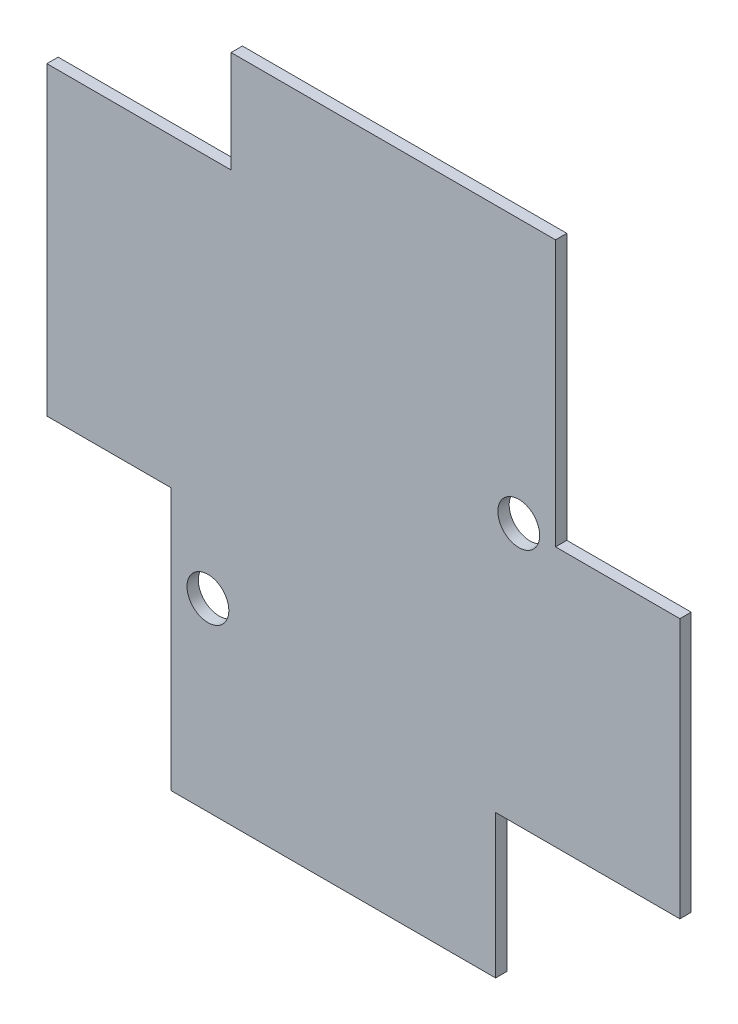
ISO-10303-21;
HEADER;
FILE_DESCRIPTION(('STEP AP214'),'2;1');
FILE_NAME('part.step','',(''),(''),'','','');
FILE_SCHEMA(('AUTOMOTIVE_DESIGN { 1 0 10303 214 1 1 1 1 }'));
ENDSEC;
DATA;
#1=APPLICATION_CONTEXT('core data for automotive mechanical design processes');
#2=APPLICATION_PROTOCOL_DEFINITION('international standard','automotive_design',2000,#1);
#3=PRODUCT_CONTEXT('',#1,'mechanical');
#4=PRODUCT('Part','Part','',(#3));
#5=PRODUCT_RELATED_PRODUCT_CATEGORY('part','',(#4));
#6=PRODUCT_DEFINITION_FORMATION('','',#4);
#7=PRODUCT_DEFINITION_CONTEXT('part definition',#1,'design');
#8=PRODUCT_DEFINITION('design','',#6,#7);
#9=PRODUCT_DEFINITION_SHAPE('','',#8);
#10=(LENGTH_UNIT() NAMED_UNIT(*) SI_UNIT(.MILLI.,.METRE.));
#11=(NAMED_UNIT(*) PLANE_ANGLE_UNIT() SI_UNIT($,.RADIAN.));
#12=(NAMED_UNIT(*) SI_UNIT($,.STERADIAN.) SOLID_ANGLE_UNIT());
#13=UNCERTAINTY_MEASURE_WITH_UNIT(LENGTH_MEASURE(1.E-05),#10,'distance_accuracy_value','');
#14=(GEOMETRIC_REPRESENTATION_CONTEXT(3) GLOBAL_UNCERTAINTY_ASSIGNED_CONTEXT((#13)) GLOBAL_UNIT_ASSIGNED_CONTEXT((#10,
#11,#12)) REPRESENTATION_CONTEXT('',''));
#15=CARTESIAN_POINT('',(0.,0.,0.));
#16=DIRECTION('',(0.,0.,1.));
#17=DIRECTION('',(1.,0.,0.));
#18=AXIS2_PLACEMENT_3D('',#15,#16,#17);
#19=CARTESIAN_POINT('',(0.,0.,-43.05));
#20=DIRECTION('',(0.,0.,1.));
#21=DIRECTION('',(1.,0.,0.));
#22=AXIS2_PLACEMENT_3D('',#19,#20,#21);
#23=PLANE('',#22);
#24=CARTESIAN_POINT('',(13.75,5.75,-43.05));
#25=DIRECTION('',(0.,0.,1.));
#26=DIRECTION('',(1.,0.,0.));
#27=AXIS2_PLACEMENT_3D('',#24,#25,#26);
#28=CIRCLE('',#27,1.85);
#29=CARTESIAN_POINT('',(15.6,5.75,-43.05));
#30=VERTEX_POINT('',#29);
#31=EDGE_CURVE('E155',#30,#30,#28,.F.);
#32=ORIENTED_EDGE('',*,*,#31,.T.);
#33=EDGE_LOOP('',(#32));
#34=FACE_BOUND('',#33,.T.);
#35=CARTESIAN_POINT('',(-13.75,-13.75,-43.05));
#36=DIRECTION('',(0.,0.,1.));
#37=DIRECTION('',(1.,0.,0.));
#38=AXIS2_PLACEMENT_3D('',#35,#36,#37);
#39=CIRCLE('',#38,1.85);
#40=CARTESIAN_POINT('',(-11.9,-13.75,-43.05));
#41=VERTEX_POINT('',#40);
#42=EDGE_CURVE('E20',#41,#41,#39,.F.);
#43=ORIENTED_EDGE('',*,*,#42,.T.);
#44=EDGE_LOOP('',(#43));
#45=FACE_BOUND('',#44,.T.);
#46=DIRECTION('',(1.,0.,0.));
#47=VECTOR('',#46,1.);
#48=CARTESIAN_POINT('',(28.,5.579559179887,-43.05));
#49=LINE('',#48,#47);
#50=CARTESIAN_POINT('',(17.,5.579559179887,-43.05));
#51=VERTEX_POINT('',#50);
#52=CARTESIAN_POINT('',(28.,5.579559179887,-43.05));
#53=VERTEX_POINT('',#52);
#54=EDGE_CURVE('E118',#51,#53,#49,.T.);
#55=ORIENTED_EDGE('',*,*,#54,.F.);
#56=DIRECTION('',(0.,1.,0.));
#57=VECTOR('',#56,1.);
#58=CARTESIAN_POINT('',(17.,-17.,-43.05));
#59=LINE('',#58,#57);
#60=CARTESIAN_POINT('',(17.,29.1,-43.05));
#61=VERTEX_POINT('',#60);
#62=EDGE_CURVE('E217',#61,#51,#59,.F.);
#63=ORIENTED_EDGE('',*,*,#62,.F.);
#64=DIRECTION('',(1.,0.,0.));
#65=VECTOR('',#64,1.);
#66=CARTESIAN_POINT('',(17.,29.1,-43.05));
#67=LINE('',#66,#65);
#68=CARTESIAN_POINT('',(-11.7,29.1,-43.05));
#69=VERTEX_POINT('',#68);
#70=EDGE_CURVE('E211',#69,#61,#67,.T.);
#71=ORIENTED_EDGE('',*,*,#70,.F.);
#72=DIRECTION('',(0.,1.,0.));
#73=VECTOR('',#72,1.);
#74=CARTESIAN_POINT('',(-11.7,21.1,-43.05));
#75=LINE('',#74,#73);
#76=CARTESIAN_POINT('',(-11.7,20.1,-43.05));
#77=VERTEX_POINT('',#76);
#78=EDGE_CURVE('E202',#69,#77,#75,.F.);
#79=ORIENTED_EDGE('',*,*,#78,.T.);
#80=DIRECTION('',(1.,0.,0.));
#81=VECTOR('',#80,1.);
#82=CARTESIAN_POINT('',(-19.45592500181,20.1,-43.05));
#83=LINE('',#82,#81);
#84=CARTESIAN_POINT('',(-28.,20.1,-43.05));
#85=VERTEX_POINT('',#84);
#86=EDGE_CURVE('E200',#77,#85,#83,.F.);
#87=ORIENTED_EDGE('',*,*,#86,.T.);
#88=DIRECTION('',(0.,1.,0.));
#89=VECTOR('',#88,1.);
#90=CARTESIAN_POINT('',(-28.,20.1,-43.05));
#91=LINE('',#90,#89);
#92=CARTESIAN_POINT('',(-28.,-6.9,-43.05));
#93=VERTEX_POINT('',#92);
#94=EDGE_CURVE('E191',#93,#85,#91,.T.);
#95=ORIENTED_EDGE('',*,*,#94,.F.);
#96=DIRECTION('',(1.,0.,0.));
#97=VECTOR('',#96,1.);
#98=CARTESIAN_POINT('',(-28.,-6.9,-43.05));
#99=LINE('',#98,#97);
#100=CARTESIAN_POINT('',(-17.,-6.9,-43.05));
#101=VERTEX_POINT('',#100);
#102=EDGE_CURVE('E188',#101,#93,#99,.F.);
#103=ORIENTED_EDGE('',*,*,#102,.F.);
#104=DIRECTION('',(0.,1.,0.));
#105=VECTOR('',#104,1.);
#106=CARTESIAN_POINT('',(-17.,17.,-43.05));
#107=LINE('',#106,#105);
#108=CARTESIAN_POINT('',(-17.,-30.1,-43.05));
#109=VERTEX_POINT('',#108);
#110=EDGE_CURVE('E182',#109,#101,#107,.T.);
#111=ORIENTED_EDGE('',*,*,#110,.F.);
#112=DIRECTION('',(1.,0.,0.));
#113=VECTOR('',#112,1.);
#114=CARTESIAN_POINT('',(-17.,-30.1,-43.05));
#115=LINE('',#114,#113);
#116=CARTESIAN_POINT('',(11.7,-30.1,-43.05));
#117=VERTEX_POINT('',#116);
#118=EDGE_CURVE('E176',#117,#109,#115,.F.);
#119=ORIENTED_EDGE('',*,*,#118,.F.);
#120=DIRECTION('',(0.,1.,0.));
#121=VECTOR('',#120,1.);
#122=CARTESIAN_POINT('',(11.7,-17.42044082011,-43.05));
#123=LINE('',#122,#121);
#124=CARTESIAN_POINT('',(11.7,-17.42044082011,-43.05));
#125=VERTEX_POINT('',#124);
#126=EDGE_CURVE('E128',#117,#125,#123,.T.);
#127=ORIENTED_EDGE('',*,*,#126,.T.);
#128=DIRECTION('',(1.,0.,0.));
#129=VECTOR('',#128,1.);
#130=CARTESIAN_POINT('',(19.97261027655,-17.42044082011,-43.05));
#131=LINE('',#130,#129);
#132=CARTESIAN_POINT('',(28.,-17.42044082011,-43.05));
#133=VERTEX_POINT('',#132);
#134=EDGE_CURVE('E124',#125,#133,#131,.T.);
#135=ORIENTED_EDGE('',*,*,#134,.T.);
#136=DIRECTION('',(0.,1.,0.));
#137=VECTOR('',#136,1.);
#138=CARTESIAN_POINT('',(28.,-17.42044082011,-43.05));
#139=LINE('',#138,#137);
#140=EDGE_CURVE('E126',#53,#133,#139,.F.);
#141=ORIENTED_EDGE('',*,*,#140,.F.);
#142=EDGE_LOOP('',(#55,#63,#71,#79,#87,#95,#103,#111,#119,#127,#135,#141));
#143=FACE_BOUND('',#142,.T.);
#144=ADVANCED_FACE('F17',(#34,#45,#143),#23,.T.);
#145=CARTESIAN_POINT('',(19.97261027655,-17.42044082011,-37.8));
#146=DIRECTION('',(0.,1.,0.));
#147=DIRECTION('',(0.,0.,1.));
#148=AXIS2_PLACEMENT_3D('',#145,#146,#147);
#149=PLANE('',#148);
#150=DIRECTION('',(1.,0.,0.));
#151=VECTOR('',#150,1.);
#152=CARTESIAN_POINT('',(0.,-17.42044082011,-44.05));
#153=LINE('',#152,#151);
#154=CARTESIAN_POINT('',(11.7,-17.42044082011,-44.05));
#155=VERTEX_POINT('',#154);
#156=CARTESIAN_POINT('',(28.,-17.42044082011,-44.05));
#157=VERTEX_POINT('',#156);
#158=EDGE_CURVE('E145',#155,#157,#153,.T.);
#159=ORIENTED_EDGE('',*,*,#158,.T.);
#160=DIRECTION('',(0.,0.,-1.));
#161=VECTOR('',#160,1.);
#162=CARTESIAN_POINT('',(28.,-17.42044082011,-43.05));
#163=LINE('',#162,#161);
#164=EDGE_CURVE('E134',#133,#157,#163,.T.);
#165=ORIENTED_EDGE('',*,*,#164,.F.);
#166=ORIENTED_EDGE('',*,*,#134,.F.);
#167=DIRECTION('',(0.,0.,1.));
#168=VECTOR('',#167,1.);
#169=CARTESIAN_POINT('',(11.7,-17.42044082011,-37.8));
#170=LINE('',#169,#168);
#171=EDGE_CURVE('E165',#125,#155,#170,.F.);
#172=ORIENTED_EDGE('',*,*,#171,.T.);
#173=EDGE_LOOP('',(#159,#165,#166,#172));
#174=FACE_BOUND('',#173,.T.);
#175=ADVANCED_FACE('F144',(#174),#149,.F.);
#176=CARTESIAN_POINT('',(28.,-17.42044082011,-43.05));
#177=DIRECTION('',(1.,0.,0.));
#178=DIRECTION('',(0.,0.,-1.));
#179=AXIS2_PLACEMENT_3D('',#176,#177,#178);
#180=PLANE('',#179);
#181=DIRECTION('',(0.,0.,1.));
#182=VECTOR('',#181,1.);
#183=CARTESIAN_POINT('',(28.,5.579559179887,-43.05));
#184=LINE('',#183,#182);
#185=CARTESIAN_POINT('',(28.,5.579559179887,-44.05));
#186=VERTEX_POINT('',#185);
#187=EDGE_CURVE('E140',#53,#186,#184,.F.);
#188=ORIENTED_EDGE('',*,*,#187,.F.);
#189=ORIENTED_EDGE('',*,*,#140,.T.);
#190=ORIENTED_EDGE('',*,*,#164,.T.);
#191=DIRECTION('',(0.,1.,0.));
#192=VECTOR('',#191,1.);
#193=CARTESIAN_POINT('',(28.,0.,-44.05));
#194=LINE('',#193,#192);
#195=EDGE_CURVE('E161',#157,#186,#194,.T.);
#196=ORIENTED_EDGE('',*,*,#195,.T.);
#197=EDGE_LOOP('',(#188,#189,#190,#196));
#198=FACE_BOUND('',#197,.T.);
#199=ADVANCED_FACE('F137',(#198),#180,.T.);
#200=CARTESIAN_POINT('',(28.,5.579559179887,-43.05));
#201=DIRECTION('',(0.,1.,0.));
#202=DIRECTION('',(0.,0.,1.));
#203=AXIS2_PLACEMENT_3D('',#200,#201,#202);
#204=PLANE('',#203);
#205=DIRECTION('',(1.,0.,0.));
#206=VECTOR('',#205,1.);
#207=CARTESIAN_POINT('',(0.,5.579559179887,-44.05));
#208=LINE('',#207,#206);
#209=CARTESIAN_POINT('',(17.,5.579559179887,-44.05));
#210=VERTEX_POINT('',#209);
#211=EDGE_CURVE('E228',#186,#210,#208,.F.);
#212=ORIENTED_EDGE('',*,*,#211,.T.);
#213=DIRECTION('',(0.,0.,-1.));
#214=VECTOR('',#213,1.);
#215=CARTESIAN_POINT('',(17.,5.579559179887,-44.05));
#216=LINE('',#215,#214);
#217=EDGE_CURVE('E214',#51,#210,#216,.T.);
#218=ORIENTED_EDGE('',*,*,#217,.F.);
#219=ORIENTED_EDGE('',*,*,#54,.T.);
#220=ORIENTED_EDGE('',*,*,#187,.T.);
#221=EDGE_LOOP('',(#212,#218,#219,#220));
#222=FACE_BOUND('',#221,.T.);
#223=ADVANCED_FACE('F296',(#222),#204,.T.);
#224=CARTESIAN_POINT('',(17.,-17.,-44.05));
#225=DIRECTION('',(1.,0.,0.));
#226=DIRECTION('',(0.,0.,-1.));
#227=AXIS2_PLACEMENT_3D('',#224,#225,#226);
#228=PLANE('',#227);
#229=ORIENTED_EDGE('',*,*,#62,.T.);
#230=ORIENTED_EDGE('',*,*,#217,.T.);
#231=DIRECTION('',(0.,1.,0.));
#232=VECTOR('',#231,1.);
#233=CARTESIAN_POINT('',(17.,0.,-44.05));
#234=LINE('',#233,#232);
#235=CARTESIAN_POINT('',(17.,29.1,-44.05));
#236=VERTEX_POINT('',#235);
#237=EDGE_CURVE('E225',#210,#236,#234,.T.);
#238=ORIENTED_EDGE('',*,*,#237,.T.);
#239=DIRECTION('',(0.,0.,1.));
#240=VECTOR('',#239,1.);
#241=CARTESIAN_POINT('',(17.,29.1,-43.05));
#242=LINE('',#241,#240);
#243=EDGE_CURVE('E208',#61,#236,#242,.F.);
#244=ORIENTED_EDGE('',*,*,#243,.F.);
#245=EDGE_LOOP('',(#229,#230,#238,#244));
#246=FACE_BOUND('',#245,.T.);
#247=ADVANCED_FACE('F295',(#246),#228,.T.);
#248=CARTESIAN_POINT('',(17.,29.1,-43.05));
#249=DIRECTION('',(0.,1.,0.));
#250=DIRECTION('',(0.,0.,1.));
#251=AXIS2_PLACEMENT_3D('',#248,#249,#250);
#252=PLANE('',#251);
#253=DIRECTION('',(1.,0.,0.));
#254=VECTOR('',#253,1.);
#255=CARTESIAN_POINT('',(0.,29.1,-44.05));
#256=LINE('',#255,#254);
#257=CARTESIAN_POINT('',(-11.7,29.1,-44.05));
#258=VERTEX_POINT('',#257);
#259=EDGE_CURVE('E227',#236,#258,#256,.F.);
#260=ORIENTED_EDGE('',*,*,#259,.T.);
#261=DIRECTION('',(0.,0.,-1.));
#262=VECTOR('',#261,1.);
#263=CARTESIAN_POINT('',(-11.7,29.1,-43.05));
#264=LINE('',#263,#262);
#265=EDGE_CURVE('E205',#258,#69,#264,.F.);
#266=ORIENTED_EDGE('',*,*,#265,.T.);
#267=ORIENTED_EDGE('',*,*,#70,.T.);
#268=ORIENTED_EDGE('',*,*,#243,.T.);
#269=EDGE_LOOP('',(#260,#266,#267,#268));
#270=FACE_BOUND('',#269,.T.);
#271=ADVANCED_FACE('F291',(#270),#252,.T.);
#272=CARTESIAN_POINT('',(-11.7,21.1,-43.05));
#273=DIRECTION('',(1.,0.,0.));
#274=DIRECTION('',(0.,0.,-1.));
#275=AXIS2_PLACEMENT_3D('',#272,#273,#274);
#276=PLANE('',#275);
#277=ORIENTED_EDGE('',*,*,#78,.F.);
#278=ORIENTED_EDGE('',*,*,#265,.F.);
#279=DIRECTION('',(0.,1.,0.));
#280=VECTOR('',#279,1.);
#281=CARTESIAN_POINT('',(-11.7,0.,-44.05));
#282=LINE('',#281,#280);
#283=CARTESIAN_POINT('',(-11.7,20.1,-44.05));
#284=VERTEX_POINT('',#283);
#285=EDGE_CURVE('E237',#258,#284,#282,.F.);
#286=ORIENTED_EDGE('',*,*,#285,.T.);
#287=DIRECTION('',(0.,0.,-1.));
#288=VECTOR('',#287,1.);
#289=CARTESIAN_POINT('',(-11.7,20.1,-43.05));
#290=LINE('',#289,#288);
#291=EDGE_CURVE('E197',#284,#77,#290,.F.);
#292=ORIENTED_EDGE('',*,*,#291,.T.);
#293=EDGE_LOOP('',(#277,#278,#286,#292));
#294=FACE_BOUND('',#293,.T.);
#295=ADVANCED_FACE('F287',(#294),#276,.F.);
#296=CARTESIAN_POINT('',(-19.45592500181,20.1,-43.05));
#297=DIRECTION('',(0.,-1.,0.));
#298=DIRECTION('',(0.,0.,-1.));
#299=AXIS2_PLACEMENT_3D('',#296,#297,#298);
#300=PLANE('',#299);
#301=DIRECTION('',(1.,0.,0.));
#302=VECTOR('',#301,1.);
#303=CARTESIAN_POINT('',(0.,20.1,-44.05));
#304=LINE('',#303,#302);
#305=CARTESIAN_POINT('',(-28.,20.1,-44.05));
#306=VERTEX_POINT('',#305);
#307=EDGE_CURVE('E240',#284,#306,#304,.F.);
#308=ORIENTED_EDGE('',*,*,#307,.T.);
#309=DIRECTION('',(0.,0.,1.));
#310=VECTOR('',#309,1.);
#311=CARTESIAN_POINT('',(-28.,20.1,-43.05));
#312=LINE('',#311,#310);
#313=EDGE_CURVE('E195',#85,#306,#312,.F.);
#314=ORIENTED_EDGE('',*,*,#313,.F.);
#315=ORIENTED_EDGE('',*,*,#86,.F.);
#316=ORIENTED_EDGE('',*,*,#291,.F.);
#317=EDGE_LOOP('',(#308,#314,#315,#316));
#318=FACE_BOUND('',#317,.T.);
#319=ADVANCED_FACE('F284',(#318),#300,.F.);
#320=CARTESIAN_POINT('',(-28.,20.1,-43.05));
#321=DIRECTION('',(-1.,0.,0.));
#322=DIRECTION('',(0.,0.,1.));
#323=AXIS2_PLACEMENT_3D('',#320,#321,#322);
#324=PLANE('',#323);
#325=DIRECTION('',(0.,0.,-1.));
#326=VECTOR('',#325,1.);
#327=CARTESIAN_POINT('',(-28.,-6.9,-43.05));
#328=LINE('',#327,#326);
#329=CARTESIAN_POINT('',(-28.,-6.9,-44.05));
#330=VERTEX_POINT('',#329);
#331=EDGE_CURVE('E185',#93,#330,#328,.T.);
#332=ORIENTED_EDGE('',*,*,#331,.F.);
#333=ORIENTED_EDGE('',*,*,#94,.T.);
#334=ORIENTED_EDGE('',*,*,#313,.T.);
#335=DIRECTION('',(0.,1.,0.));
#336=VECTOR('',#335,1.);
#337=CARTESIAN_POINT('',(-28.,0.,-44.05));
#338=LINE('',#337,#336);
#339=EDGE_CURVE('E243',#306,#330,#338,.F.);
#340=ORIENTED_EDGE('',*,*,#339,.T.);
#341=EDGE_LOOP('',(#332,#333,#334,#340));
#342=FACE_BOUND('',#341,.T.);
#343=ADVANCED_FACE('F279',(#342),#324,.T.);
#344=CARTESIAN_POINT('',(-28.,-6.9,-43.05));
#345=DIRECTION('',(0.,-1.,0.));
#346=DIRECTION('',(0.,0.,-1.));
#347=AXIS2_PLACEMENT_3D('',#344,#345,#346);
#348=PLANE('',#347);
#349=DIRECTION('',(1.,0.,0.));
#350=VECTOR('',#349,1.);
#351=CARTESIAN_POINT('',(0.,-6.9,-44.05));
#352=LINE('',#351,#350);
#353=CARTESIAN_POINT('',(-17.,-6.9,-44.05));
#354=VERTEX_POINT('',#353);
#355=EDGE_CURVE('E247',#330,#354,#352,.T.);
#356=ORIENTED_EDGE('',*,*,#355,.T.);
#357=DIRECTION('',(0.,0.,1.));
#358=VECTOR('',#357,1.);
#359=CARTESIAN_POINT('',(-17.,-6.9,-44.05));
#360=LINE('',#359,#358);
#361=EDGE_CURVE('E179',#101,#354,#360,.F.);
#362=ORIENTED_EDGE('',*,*,#361,.F.);
#363=ORIENTED_EDGE('',*,*,#102,.T.);
#364=ORIENTED_EDGE('',*,*,#331,.T.);
#365=EDGE_LOOP('',(#356,#362,#363,#364));
#366=FACE_BOUND('',#365,.T.);
#367=ADVANCED_FACE('F275',(#366),#348,.T.);
#368=CARTESIAN_POINT('',(-17.,17.,-44.05));
#369=DIRECTION('',(-1.,0.,0.));
#370=DIRECTION('',(0.,0.,1.));
#371=AXIS2_PLACEMENT_3D('',#368,#369,#370);
#372=PLANE('',#371);
#373=ORIENTED_EDGE('',*,*,#110,.T.);
#374=ORIENTED_EDGE('',*,*,#361,.T.);
#375=DIRECTION('',(0.,1.,0.));
#376=VECTOR('',#375,1.);
#377=CARTESIAN_POINT('',(-17.,0.,-44.05));
#378=LINE('',#377,#376);
#379=CARTESIAN_POINT('',(-17.,-30.1,-44.05));
#380=VERTEX_POINT('',#379);
#381=EDGE_CURVE('E251',#354,#380,#378,.F.);
#382=ORIENTED_EDGE('',*,*,#381,.T.);
#383=DIRECTION('',(0.,0.,-1.));
#384=VECTOR('',#383,1.);
#385=CARTESIAN_POINT('',(-17.,-30.1,-43.05));
#386=LINE('',#385,#384);
#387=EDGE_CURVE('E173',#109,#380,#386,.T.);
#388=ORIENTED_EDGE('',*,*,#387,.F.);
#389=EDGE_LOOP('',(#373,#374,#382,#388));
#390=FACE_BOUND('',#389,.T.);
#391=ADVANCED_FACE('F269',(#390),#372,.T.);
#392=CARTESIAN_POINT('',(-17.,-30.1,-43.05));
#393=DIRECTION('',(0.,-1.,0.));
#394=DIRECTION('',(0.,0.,-1.));
#395=AXIS2_PLACEMENT_3D('',#392,#393,#394);
#396=PLANE('',#395);
#397=DIRECTION('',(1.,0.,0.));
#398=VECTOR('',#397,1.);
#399=CARTESIAN_POINT('',(0.,-30.1,-44.05));
#400=LINE('',#399,#398);
#401=CARTESIAN_POINT('',(11.7,-30.1,-44.05));
#402=VERTEX_POINT('',#401);
#403=EDGE_CURVE('E255',#380,#402,#400,.T.);
#404=ORIENTED_EDGE('',*,*,#403,.T.);
#405=DIRECTION('',(0.,0.,1.));
#406=VECTOR('',#405,1.);
#407=CARTESIAN_POINT('',(11.7,-30.1,-37.8));
#408=LINE('',#407,#406);
#409=EDGE_CURVE('E36',#402,#117,#408,.T.);
#410=ORIENTED_EDGE('',*,*,#409,.T.);
#411=ORIENTED_EDGE('',*,*,#118,.T.);
#412=ORIENTED_EDGE('',*,*,#387,.T.);
#413=EDGE_LOOP('',(#404,#410,#411,#412));
#414=FACE_BOUND('',#413,.T.);
#415=ADVANCED_FACE('F265',(#414),#396,.T.);
#416=CARTESIAN_POINT('',(11.7,-17.42044082011,-37.8));
#417=DIRECTION('',(-1.,0.,0.));
#418=DIRECTION('',(0.,0.,1.));
#419=AXIS2_PLACEMENT_3D('',#416,#417,#418);
#420=PLANE('',#419);
#421=ORIENTED_EDGE('',*,*,#126,.F.);
#422=ORIENTED_EDGE('',*,*,#409,.F.);
#423=DIRECTION('',(0.,1.,0.));
#424=VECTOR('',#423,1.);
#425=CARTESIAN_POINT('',(11.7,0.,-44.05));
#426=LINE('',#425,#424);
#427=EDGE_CURVE('E154',#402,#155,#426,.T.);
#428=ORIENTED_EDGE('',*,*,#427,.T.);
#429=ORIENTED_EDGE('',*,*,#171,.F.);
#430=EDGE_LOOP('',(#421,#422,#428,#429));
#431=FACE_BOUND('',#430,.T.);
#432=ADVANCED_FACE('F259',(#431),#420,.F.);
#433=CARTESIAN_POINT('',(-13.75,-13.75,-43.05));
#434=DIRECTION('',(0.,0.,1.));
#435=DIRECTION('',(1.,0.,0.));
#436=AXIS2_PLACEMENT_3D('',#433,#434,#435);
#437=CYLINDRICAL_SURFACE('',#436,1.85);
#438=ORIENTED_EDGE('',*,*,#42,.F.);
#439=EDGE_LOOP('',(#438));
#440=FACE_BOUND('',#439,.T.);
#441=CARTESIAN_POINT('',(-13.75,-13.75,-44.05));
#442=DIRECTION('',(0.,0.,1.));
#443=DIRECTION('',(1.,0.,0.));
#444=AXIS2_PLACEMENT_3D('',#441,#442,#443);
#445=CIRCLE('',#444,1.85);
#446=CARTESIAN_POINT('',(-11.9,-13.75,-44.05));
#447=VERTEX_POINT('',#446);
#448=EDGE_CURVE('E27',#447,#447,#445,.F.);
#449=ORIENTED_EDGE('',*,*,#448,.T.);
#450=EDGE_LOOP('',(#449));
#451=FACE_BOUND('',#450,.T.);
#452=ADVANCED_FACE('F313',(#440,#451),#437,.F.);
#453=CARTESIAN_POINT('',(13.75,5.75,-43.05));
#454=DIRECTION('',(0.,0.,1.));
#455=DIRECTION('',(1.,0.,0.));
#456=AXIS2_PLACEMENT_3D('',#453,#454,#455);
#457=CYLINDRICAL_SURFACE('',#456,1.85);
#458=ORIENTED_EDGE('',*,*,#31,.F.);
#459=EDGE_LOOP('',(#458));
#460=FACE_BOUND('',#459,.T.);
#461=CARTESIAN_POINT('',(13.75,5.75,-44.05));
#462=DIRECTION('',(0.,0.,1.));
#463=DIRECTION('',(1.,0.,0.));
#464=AXIS2_PLACEMENT_3D('',#461,#462,#463);
#465=CIRCLE('',#464,1.85);
#466=CARTESIAN_POINT('',(15.6,5.75,-44.05));
#467=VERTEX_POINT('',#466);
#468=EDGE_CURVE('E11',#467,#467,#465,.F.);
#469=ORIENTED_EDGE('',*,*,#468,.T.);
#470=EDGE_LOOP('',(#469));
#471=FACE_BOUND('',#470,.T.);
#472=ADVANCED_FACE('F307',(#460,#471),#457,.F.);
#473=CARTESIAN_POINT('',(0.,0.,-44.05));
#474=DIRECTION('',(0.,0.,1.));
#475=DIRECTION('',(1.,0.,0.));
#476=AXIS2_PLACEMENT_3D('',#473,#474,#475);
#477=PLANE('',#476);
#478=ORIENTED_EDGE('',*,*,#468,.F.);
#479=EDGE_LOOP('',(#478));
#480=FACE_BOUND('',#479,.T.);
#481=ORIENTED_EDGE('',*,*,#448,.F.);
#482=EDGE_LOOP('',(#481));
#483=FACE_BOUND('',#482,.T.);
#484=ORIENTED_EDGE('',*,*,#403,.F.);
#485=ORIENTED_EDGE('',*,*,#381,.F.);
#486=ORIENTED_EDGE('',*,*,#355,.F.);
#487=ORIENTED_EDGE('',*,*,#339,.F.);
#488=ORIENTED_EDGE('',*,*,#307,.F.);
#489=ORIENTED_EDGE('',*,*,#285,.F.);
#490=ORIENTED_EDGE('',*,*,#259,.F.);
#491=ORIENTED_EDGE('',*,*,#237,.F.);
#492=ORIENTED_EDGE('',*,*,#211,.F.);
#493=ORIENTED_EDGE('',*,*,#195,.F.);
#494=ORIENTED_EDGE('',*,*,#158,.F.);
#495=ORIENTED_EDGE('',*,*,#427,.F.);
#496=EDGE_LOOP('',(#484,#485,#486,#487,#488,#489,#490,#491,#492,#493,#494,#495));
#497=FACE_BOUND('',#496,.T.);
#498=ADVANCED_FACE('F262',(#480,#483,#497),#477,.F.);
#499=CLOSED_SHELL('',(#144,#175,#199,#223,#247,#271,#295,#319,#343,#367,#391,#415,#432,#452,
#472,#498));
#500=MANIFOLD_SOLID_BREP('B1',#499);
#501=ADVANCED_BREP_SHAPE_REPRESENTATION('',(#18,#500),#14);
#502=SHAPE_DEFINITION_REPRESENTATION(#9,#501);
ENDSEC;
END-ISO-10303-21;
